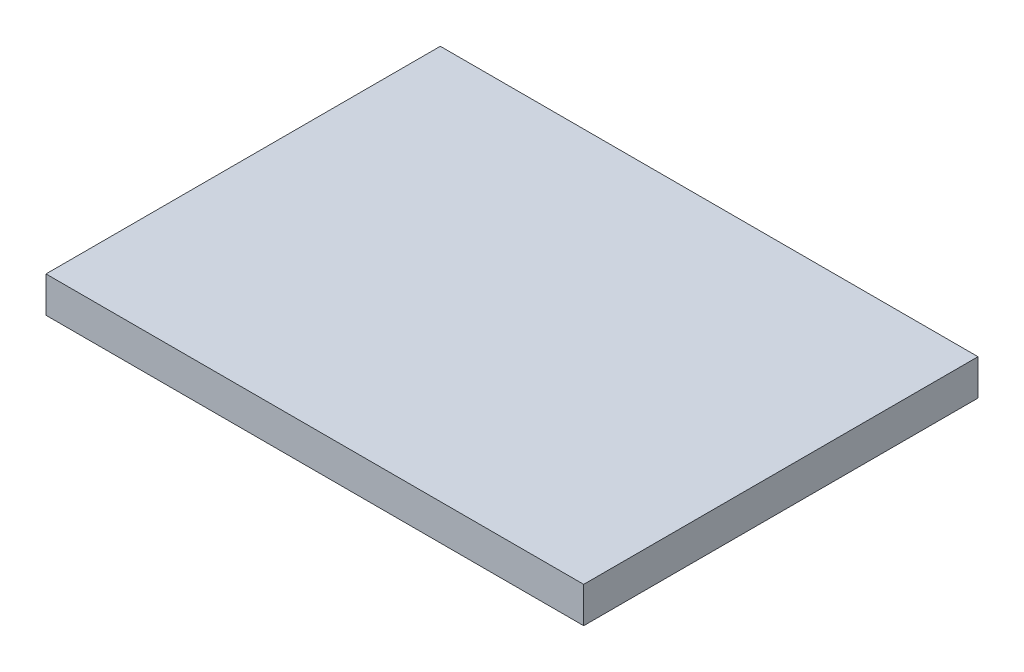
ISO-10303-21;
HEADER;
FILE_DESCRIPTION(('STEP AP214'),'2;1');
FILE_NAME('part.step','',(''),(''),'','','');
FILE_SCHEMA(('AUTOMOTIVE_DESIGN { 1 0 10303 214 1 1 1 1 }'));
ENDSEC;
DATA;
#1=APPLICATION_CONTEXT('core data for automotive mechanical design processes');
#2=APPLICATION_PROTOCOL_DEFINITION('international standard','automotive_design',2000,#1);
#3=PRODUCT_CONTEXT('',#1,'mechanical');
#4=PRODUCT('Part','Part','',(#3));
#5=PRODUCT_RELATED_PRODUCT_CATEGORY('part','',(#4));
#6=PRODUCT_DEFINITION_FORMATION('','',#4);
#7=PRODUCT_DEFINITION_CONTEXT('part definition',#1,'design');
#8=PRODUCT_DEFINITION('design','',#6,#7);
#9=PRODUCT_DEFINITION_SHAPE('','',#8);
#10=(LENGTH_UNIT() NAMED_UNIT(*) SI_UNIT(.MILLI.,.METRE.));
#11=(NAMED_UNIT(*) PLANE_ANGLE_UNIT() SI_UNIT($,.RADIAN.));
#12=(NAMED_UNIT(*) SI_UNIT($,.STERADIAN.) SOLID_ANGLE_UNIT());
#13=UNCERTAINTY_MEASURE_WITH_UNIT(LENGTH_MEASURE(1.E-05),#10,'distance_accuracy_value','');
#14=(GEOMETRIC_REPRESENTATION_CONTEXT(3) GLOBAL_UNCERTAINTY_ASSIGNED_CONTEXT((#13)) GLOBAL_UNIT_ASSIGNED_CONTEXT((#10,
#11,#12)) REPRESENTATION_CONTEXT('',''));
#15=CARTESIAN_POINT('',(0.,0.,0.));
#16=DIRECTION('',(0.,0.,1.));
#17=DIRECTION('',(1.,0.,0.));
#18=AXIS2_PLACEMENT_3D('',#15,#16,#17);
#19=CARTESIAN_POINT('',(0.,10.,0.));
#20=DIRECTION('',(1.,0.,0.));
#21=DIRECTION('',(0.,0.,-1.));
#22=AXIS2_PLACEMENT_3D('',#19,#20,#21);
#23=PLANE('',#22);
#24=DIRECTION('',(0.,0.,1.));
#25=VECTOR('',#24,1.);
#26=CARTESIAN_POINT('',(0.,0.,0.));
#27=LINE('',#26,#25);
#28=CARTESIAN_POINT('',(0.,0.,-110.));
#29=VERTEX_POINT('',#28);
#30=CARTESIAN_POINT('',(0.,0.,0.));
#31=VERTEX_POINT('',#30);
#32=EDGE_CURVE('E96',#29,#31,#27,.T.);
#33=ORIENTED_EDGE('',*,*,#32,.T.);
#34=DIRECTION('',(0.,-1.,0.));
#35=VECTOR('',#34,1.);
#36=CARTESIAN_POINT('',(0.,10.,0.));
#37=LINE('',#36,#35);
#38=CARTESIAN_POINT('',(0.,10.,0.));
#39=VERTEX_POINT('',#38);
#40=EDGE_CURVE('E11',#39,#31,#37,.T.);
#41=ORIENTED_EDGE('',*,*,#40,.F.);
#42=DIRECTION('',(0.,0.,1.));
#43=VECTOR('',#42,1.);
#44=CARTESIAN_POINT('',(0.,10.,0.));
#45=LINE('',#44,#43);
#46=CARTESIAN_POINT('',(0.,10.,-110.));
#47=VERTEX_POINT('',#46);
#48=EDGE_CURVE('E84',#47,#39,#45,.T.);
#49=ORIENTED_EDGE('',*,*,#48,.F.);
#50=DIRECTION('',(0.,-1.,0.));
#51=VECTOR('',#50,1.);
#52=CARTESIAN_POINT('',(0.,10.,-110.));
#53=LINE('',#52,#51);
#54=EDGE_CURVE('E92',#47,#29,#53,.T.);
#55=ORIENTED_EDGE('',*,*,#54,.T.);
#56=EDGE_LOOP('',(#33,#41,#49,#55));
#57=FACE_BOUND('',#56,.T.);
#58=ADVANCED_FACE('F33',(#57),#23,.F.);
#59=CARTESIAN_POINT('',(0.,10.,0.));
#60=DIRECTION('',(0.,0.,-1.));
#61=DIRECTION('',(-1.,0.,0.));
#62=AXIS2_PLACEMENT_3D('',#59,#60,#61);
#63=PLANE('',#62);
#64=DIRECTION('',(1.,0.,0.));
#65=VECTOR('',#64,1.);
#66=CARTESIAN_POINT('',(0.,0.,0.));
#67=LINE('',#66,#65);
#68=CARTESIAN_POINT('',(150.,0.,0.));
#69=VERTEX_POINT('',#68);
#70=EDGE_CURVE('E88',#31,#69,#67,.T.);
#71=ORIENTED_EDGE('',*,*,#70,.T.);
#72=DIRECTION('',(0.,-1.,0.));
#73=VECTOR('',#72,1.);
#74=CARTESIAN_POINT('',(150.,10.,0.));
#75=LINE('',#74,#73);
#76=CARTESIAN_POINT('',(150.,10.,0.));
#77=VERTEX_POINT('',#76);
#78=EDGE_CURVE('E41',#77,#69,#75,.T.);
#79=ORIENTED_EDGE('',*,*,#78,.F.);
#80=DIRECTION('',(1.,0.,0.));
#81=VECTOR('',#80,1.);
#82=CARTESIAN_POINT('',(0.,10.,0.));
#83=LINE('',#82,#81);
#84=EDGE_CURVE('E79',#39,#77,#83,.T.);
#85=ORIENTED_EDGE('',*,*,#84,.F.);
#86=ORIENTED_EDGE('',*,*,#40,.T.);
#87=EDGE_LOOP('',(#71,#79,#85,#86));
#88=FACE_BOUND('',#87,.T.);
#89=ADVANCED_FACE('F87',(#88),#63,.F.);
#90=CARTESIAN_POINT('',(150.,10.,0.));
#91=DIRECTION('',(-1.,0.,0.));
#92=DIRECTION('',(0.,0.,1.));
#93=AXIS2_PLACEMENT_3D('',#90,#91,#92);
#94=PLANE('',#93);
#95=DIRECTION('',(0.,0.,-1.));
#96=VECTOR('',#95,1.);
#97=CARTESIAN_POINT('',(150.,0.,0.));
#98=LINE('',#97,#96);
#99=CARTESIAN_POINT('',(150.,0.,-110.));
#100=VERTEX_POINT('',#99);
#101=EDGE_CURVE('E66',#69,#100,#98,.T.);
#102=ORIENTED_EDGE('',*,*,#101,.T.);
#103=DIRECTION('',(0.,-1.,0.));
#104=VECTOR('',#103,1.);
#105=CARTESIAN_POINT('',(150.,10.,-110.));
#106=LINE('',#105,#104);
#107=CARTESIAN_POINT('',(150.,10.,-110.));
#108=VERTEX_POINT('',#107);
#109=EDGE_CURVE('E89',#108,#100,#106,.T.);
#110=ORIENTED_EDGE('',*,*,#109,.F.);
#111=DIRECTION('',(0.,0.,-1.));
#112=VECTOR('',#111,1.);
#113=CARTESIAN_POINT('',(150.,10.,0.));
#114=LINE('',#113,#112);
#115=EDGE_CURVE('E82',#77,#108,#114,.T.);
#116=ORIENTED_EDGE('',*,*,#115,.F.);
#117=ORIENTED_EDGE('',*,*,#78,.T.);
#118=EDGE_LOOP('',(#102,#110,#116,#117));
#119=FACE_BOUND('',#118,.T.);
#120=ADVANCED_FACE('F90',(#119),#94,.F.);
#121=CARTESIAN_POINT('',(0.,10.,-110.));
#122=DIRECTION('',(0.,0.,1.));
#123=DIRECTION('',(1.,0.,0.));
#124=AXIS2_PLACEMENT_3D('',#121,#122,#123);
#125=PLANE('',#124);
#126=DIRECTION('',(-1.,0.,0.));
#127=VECTOR('',#126,1.);
#128=CARTESIAN_POINT('',(0.,0.,-110.));
#129=LINE('',#128,#127);
#130=EDGE_CURVE('E72',#100,#29,#129,.T.);
#131=ORIENTED_EDGE('',*,*,#130,.T.);
#132=ORIENTED_EDGE('',*,*,#54,.F.);
#133=DIRECTION('',(-1.,0.,0.));
#134=VECTOR('',#133,1.);
#135=CARTESIAN_POINT('',(0.,10.,-110.));
#136=LINE('',#135,#134);
#137=EDGE_CURVE('E49',#108,#47,#136,.T.);
#138=ORIENTED_EDGE('',*,*,#137,.F.);
#139=ORIENTED_EDGE('',*,*,#109,.T.);
#140=EDGE_LOOP('',(#131,#132,#138,#139));
#141=FACE_BOUND('',#140,.T.);
#142=ADVANCED_FACE('F103',(#141),#125,.F.);
#143=CARTESIAN_POINT('',(0.,10.,0.));
#144=DIRECTION('',(0.,-1.,0.));
#145=DIRECTION('',(0.,0.,-1.));
#146=AXIS2_PLACEMENT_3D('',#143,#144,#145);
#147=PLANE('',#146);
#148=ORIENTED_EDGE('',*,*,#48,.T.);
#149=ORIENTED_EDGE('',*,*,#84,.T.);
#150=ORIENTED_EDGE('',*,*,#115,.T.);
#151=ORIENTED_EDGE('',*,*,#137,.T.);
#152=EDGE_LOOP('',(#148,#149,#150,#151));
#153=FACE_BOUND('',#152,.T.);
#154=ADVANCED_FACE('F80',(#153),#147,.F.);
#155=CARTESIAN_POINT('',(0.,0.,0.));
#156=DIRECTION('',(0.,-1.,0.));
#157=DIRECTION('',(0.,0.,-1.));
#158=AXIS2_PLACEMENT_3D('',#155,#156,#157);
#159=PLANE('',#158);
#160=ORIENTED_EDGE('',*,*,#32,.F.);
#161=ORIENTED_EDGE('',*,*,#130,.F.);
#162=ORIENTED_EDGE('',*,*,#101,.F.);
#163=ORIENTED_EDGE('',*,*,#70,.F.);
#164=EDGE_LOOP('',(#160,#161,#162,#163));
#165=FACE_BOUND('',#164,.T.);
#166=ADVANCED_FACE('F106',(#165),#159,.T.);
#167=CLOSED_SHELL('',(#58,#89,#120,#142,#154,#166));
#168=MANIFOLD_SOLID_BREP('B2',#167);
#169=ADVANCED_BREP_SHAPE_REPRESENTATION('',(#18,#168),#14);
#170=SHAPE_DEFINITION_REPRESENTATION(#9,#169);
ENDSEC;
END-ISO-10303-21;
